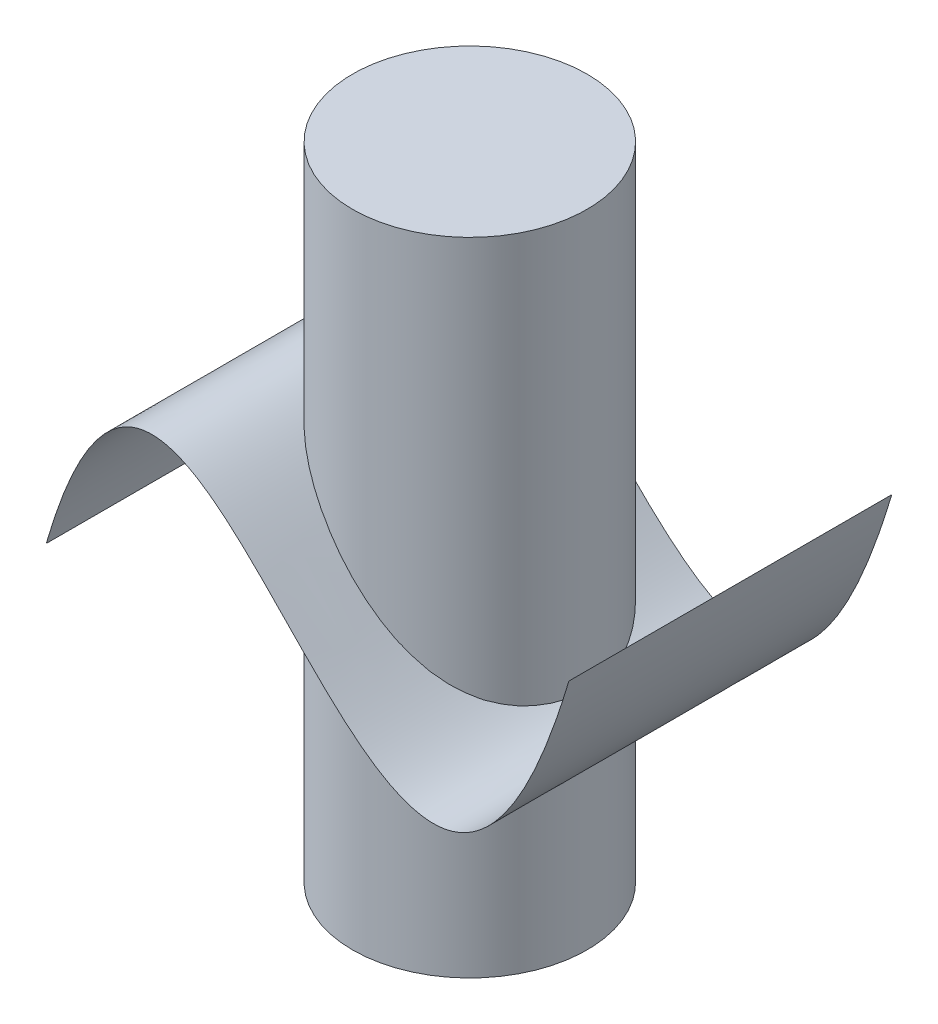
ISO-10303-21;
HEADER;
FILE_DESCRIPTION(('STEP AP214'),'2;1');
FILE_NAME('part.step','',(''),(''),'','','');
FILE_SCHEMA(('AUTOMOTIVE_DESIGN { 1 0 10303 214 1 1 1 1 }'));
ENDSEC;
DATA;
#1=APPLICATION_CONTEXT('core data for automotive mechanical design processes');
#2=APPLICATION_PROTOCOL_DEFINITION('international standard','automotive_design',2000,#1);
#3=PRODUCT_CONTEXT('',#1,'mechanical');
#4=PRODUCT('Part','Part','',(#3));
#5=PRODUCT_RELATED_PRODUCT_CATEGORY('part','',(#4));
#6=PRODUCT_DEFINITION_FORMATION('','',#4);
#7=PRODUCT_DEFINITION_CONTEXT('part definition',#1,'design');
#8=PRODUCT_DEFINITION('design','',#6,#7);
#9=PRODUCT_DEFINITION_SHAPE('','',#8);
#10=(LENGTH_UNIT() NAMED_UNIT(*) SI_UNIT(.MILLI.,.METRE.));
#11=(NAMED_UNIT(*) PLANE_ANGLE_UNIT() SI_UNIT($,.RADIAN.));
#12=(NAMED_UNIT(*) SI_UNIT($,.STERADIAN.) SOLID_ANGLE_UNIT());
#13=UNCERTAINTY_MEASURE_WITH_UNIT(LENGTH_MEASURE(1.E-05),#10,'distance_accuracy_value','');
#14=(GEOMETRIC_REPRESENTATION_CONTEXT(3) GLOBAL_UNCERTAINTY_ASSIGNED_CONTEXT((#13)) GLOBAL_UNIT_ASSIGNED_CONTEXT((#10,
#11,#12)) REPRESENTATION_CONTEXT('',''));
#15=CARTESIAN_POINT('',(0.,0.,0.));
#16=DIRECTION('',(0.,0.,1.));
#17=DIRECTION('',(1.,0.,0.));
#18=AXIS2_PLACEMENT_3D('',#15,#16,#17);
#19=CARTESIAN_POINT('',(21.597622001997,145.,-11.0547989535386));
#20=DIRECTION('',(0.,-1.,0.));
#21=DIRECTION('',(0.,0.,-1.));
#22=AXIS2_PLACEMENT_3D('',#19,#20,#21);
#23=CYLINDRICAL_SURFACE('',#22,53.0044303772864);
#24=CARTESIAN_POINT('',(21.597622001997,145.,-11.0547989535386));
#25=DIRECTION('',(0.,1.,0.));
#26=DIRECTION('',(0.,0.,1.));
#27=AXIS2_PLACEMENT_3D('',#24,#25,#26);
#28=CIRCLE('',#27,53.0044303772864);
#29=CARTESIAN_POINT('',(21.597622001997,145.,41.9496314237478));
#30=VERTEX_POINT('',#29);
#31=EDGE_CURVE('E11',#30,#30,#28,.T.);
#32=ORIENTED_EDGE('',*,*,#31,.F.);
#33=EDGE_LOOP('',(#32));
#34=FACE_BOUND('',#33,.T.);
#35=CARTESIAN_POINT('',(21.597622001997,-145.,-11.0547989535386));
#36=DIRECTION('',(0.,1.,0.));
#37=DIRECTION('',(0.,0.,1.));
#38=AXIS2_PLACEMENT_3D('',#35,#36,#37);
#39=CIRCLE('',#38,53.0044303772864);
#40=CARTESIAN_POINT('',(21.597622001997,-145.,41.9496314237478));
#41=VERTEX_POINT('',#40);
#42=EDGE_CURVE('E50',#41,#41,#39,.T.);
#43=ORIENTED_EDGE('',*,*,#42,.T.);
#44=EDGE_LOOP('',(#43));
#45=FACE_BOUND('',#44,.T.);
#46=ADVANCED_FACE('F47',(#34,#45),#23,.T.);
#47=CARTESIAN_POINT('',(21.597622001997,145.,-11.0547989535386));
#48=DIRECTION('',(0.,1.,0.));
#49=DIRECTION('',(0.,0.,1.));
#50=AXIS2_PLACEMENT_3D('',#47,#48,#49);
#51=PLANE('',#50);
#52=ORIENTED_EDGE('',*,*,#31,.T.);
#53=EDGE_LOOP('',(#52));
#54=FACE_BOUND('',#53,.T.);
#55=ADVANCED_FACE('F62',(#54),#51,.T.);
#56=CARTESIAN_POINT('',(21.597622001997,-145.,-11.0547989535386));
#57=DIRECTION('',(0.,1.,0.));
#58=DIRECTION('',(0.,0.,1.));
#59=AXIS2_PLACEMENT_3D('',#56,#57,#58);
#60=PLANE('',#59);
#61=ORIENTED_EDGE('',*,*,#42,.F.);
#62=EDGE_LOOP('',(#61));
#63=FACE_BOUND('',#62,.T.);
#64=ADVANCED_FACE('F60',(#63),#60,.F.);
#65=CLOSED_SHELL('',(#46,#55,#64));
#66=MANIFOLD_SOLID_BREP('B2',#65);
#67=CARTESIAN_POINT('',(-85.8726334846333,-24.0495655421195,-73.0000000000001));
#68=CARTESIAN_POINT('',(-22.8274179411478,193.374091444148,-73.0000000000001));
#69=CARTESIAN_POINT('',(74.8966516496112,-213.233059820131,-73.0000000000001));
#70=CARTESIAN_POINT('',(150.440488798802,40.2568814509392,-73.0000000000001));
#71=B_SPLINE_CURVE_WITH_KNOTS('',3,(#67,#68,#69,#70),.UNSPECIFIED.,.F.,.F.,(4,4),(0.,1.),.UNSPECIFIED.);
#72=DIRECTION('',(0.,0.,1.));
#73=VECTOR('',#72,1.);
#74=SURFACE_OF_LINEAR_EXTRUSION('',#71,#73);
#75=CARTESIAN_POINT('',(-85.8726334846333,-24.0495655421195,73.0000000000001));
#76=CARTESIAN_POINT('',(-22.8274179411478,193.374091444148,73.0000000000001));
#77=CARTESIAN_POINT('',(74.8966516496112,-213.233059820131,73.0000000000001));
#78=CARTESIAN_POINT('',(150.440488798802,40.2568814509392,73.0000000000001));
#79=B_SPLINE_CURVE_WITH_KNOTS('',3,(#75,#76,#77,#78),.UNSPECIFIED.,.F.,.F.,(4,4),(0.,1.),.UNSPECIFIED.);
#80=CARTESIAN_POINT('',(-85.8726334846333,-24.0495655421195,73.0000000000001));
#81=VERTEX_POINT('',#80);
#82=CARTESIAN_POINT('',(150.440488798802,40.2568814509392,73.0000000000001));
#83=VERTEX_POINT('',#82);
#84=EDGE_CURVE('E114',#81,#83,#79,.T.);
#85=ORIENTED_EDGE('',*,*,#84,.F.);
#86=DIRECTION('',(0.,0.,1.));
#87=VECTOR('',#86,1.);
#88=CARTESIAN_POINT('',(-85.8726334846333,-24.0495655421195,-73.0000000000001));
#89=LINE('',#88,#87);
#90=CARTESIAN_POINT('',(-85.8726334846333,-24.0495655421195,-73.0000000000001));
#91=VERTEX_POINT('',#90);
#92=EDGE_CURVE('E96',#91,#81,#89,.T.);
#93=ORIENTED_EDGE('',*,*,#92,.F.);
#94=CARTESIAN_POINT('',(150.440488798802,40.2568814509392,-73.0000000000001));
#95=VERTEX_POINT('',#94);
#96=EDGE_CURVE('E102',#91,#95,#71,.T.);
#97=ORIENTED_EDGE('',*,*,#96,.T.);
#98=DIRECTION('',(0.,0.,1.));
#99=VECTOR('',#98,1.);
#100=CARTESIAN_POINT('',(150.440488798802,40.2568814509392,-73.0000000000001));
#101=LINE('',#100,#99);
#102=EDGE_CURVE('E45',#95,#83,#101,.T.);
#103=ORIENTED_EDGE('',*,*,#102,.T.);
#104=EDGE_LOOP('',(#85,#93,#97,#103));
#105=FACE_BOUND('',#104,.T.);
#106=ADVANCED_FACE('F94',(#105),#74,.T.);
#107=OPEN_SHELL('',(#106));
#108=SHELL_BASED_SURFACE_MODEL('B6',(#107));
#109=ADVANCED_BREP_SHAPE_REPRESENTATION('',(#18,#66),#14);
#110=MANIFOLD_SURFACE_SHAPE_REPRESENTATION('',(#18,#108),#14);
#111=SHAPE_REPRESENTATION('',(#18),#14);
#112=SHAPE_DEFINITION_REPRESENTATION(#9,#111);
#113=SHAPE_REPRESENTATION_RELATIONSHIP('','',#111,#109);
#114=SHAPE_REPRESENTATION_RELATIONSHIP('','',#111,#110);
ENDSEC;
END-ISO-10303-21;
